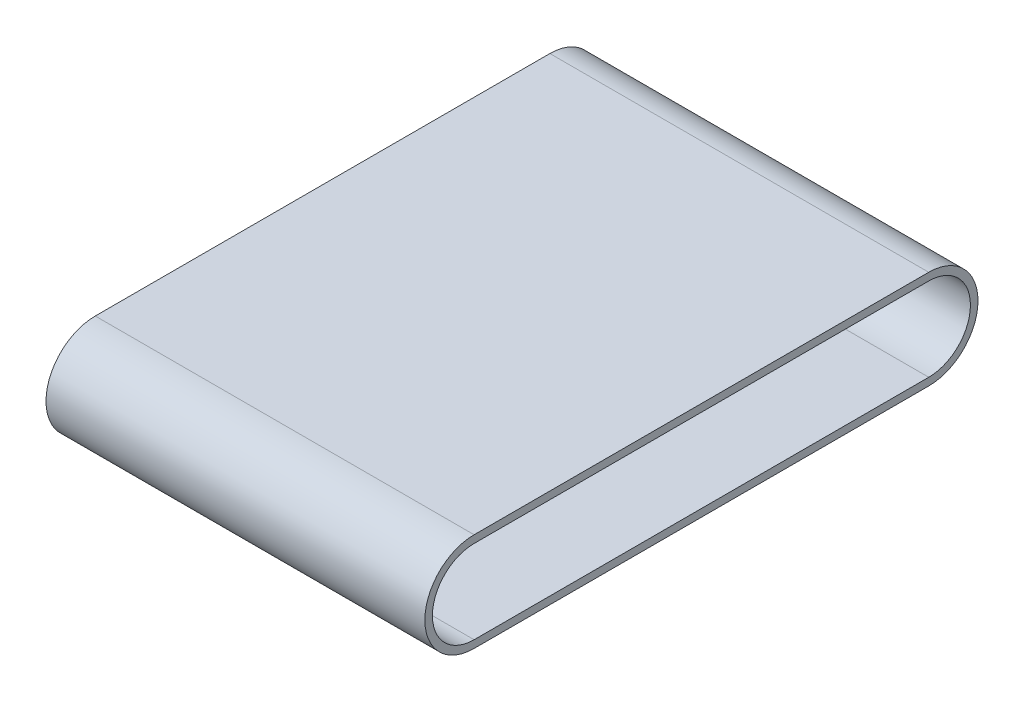
ISO-10303-21;
HEADER;
FILE_DESCRIPTION(('STEP AP214'),'2;1');
FILE_NAME('part.step','',(''),(''),'','','');
FILE_SCHEMA(('AUTOMOTIVE_DESIGN { 1 0 10303 214 1 1 1 1 }'));
ENDSEC;
DATA;
#1=APPLICATION_CONTEXT('core data for automotive mechanical design processes');
#2=APPLICATION_PROTOCOL_DEFINITION('international standard','automotive_design',2000,#1);
#3=PRODUCT_CONTEXT('',#1,'mechanical');
#4=PRODUCT('Part','Part','',(#3));
#5=PRODUCT_RELATED_PRODUCT_CATEGORY('part','',(#4));
#6=PRODUCT_DEFINITION_FORMATION('','',#4);
#7=PRODUCT_DEFINITION_CONTEXT('part definition',#1,'design');
#8=PRODUCT_DEFINITION('design','',#6,#7);
#9=PRODUCT_DEFINITION_SHAPE('','',#8);
#10=(LENGTH_UNIT() NAMED_UNIT(*) SI_UNIT(.MILLI.,.METRE.));
#11=(NAMED_UNIT(*) PLANE_ANGLE_UNIT() SI_UNIT($,.RADIAN.));
#12=(NAMED_UNIT(*) SI_UNIT($,.STERADIAN.) SOLID_ANGLE_UNIT());
#13=UNCERTAINTY_MEASURE_WITH_UNIT(LENGTH_MEASURE(1.E-05),#10,'distance_accuracy_value','');
#14=(GEOMETRIC_REPRESENTATION_CONTEXT(3) GLOBAL_UNCERTAINTY_ASSIGNED_CONTEXT((#13)) GLOBAL_UNIT_ASSIGNED_CONTEXT((#10,
#11,#12)) REPRESENTATION_CONTEXT('',''));
#15=CARTESIAN_POINT('',(0.,0.,0.));
#16=DIRECTION('',(0.,0.,1.));
#17=DIRECTION('',(1.,0.,0.));
#18=AXIS2_PLACEMENT_3D('',#15,#16,#17);
#19=CARTESIAN_POINT('',(100.,22.8481012658228,183.678713125152));
#20=DIRECTION('',(1.,0.,0.));
#21=DIRECTION('',(0.,0.,-1.));
#22=AXIS2_PLACEMENT_3D('',#19,#20,#21);
#23=PLANE('',#22);
#24=CARTESIAN_POINT('',(100.,22.8481012658228,183.678713125152));
#25=DIRECTION('',(1.,0.,0.));
#26=DIRECTION('',(0.,0.,-1.));
#27=AXIS2_PLACEMENT_3D('',#24,#25,#26);
#28=CIRCLE('',#27,13.);
#29=CARTESIAN_POINT('',(100.,35.8481012658228,183.678713125152));
#30=VERTEX_POINT('',#29);
#31=CARTESIAN_POINT('',(100.,9.84810126582282,183.678713125152));
#32=VERTEX_POINT('',#31);
#33=EDGE_CURVE('E136',#30,#32,#28,.T.);
#34=ORIENTED_EDGE('',*,*,#33,.T.);
#35=DIRECTION('',(0.,0.,-1.));
#36=VECTOR('',#35,1.);
#37=CARTESIAN_POINT('',(100.,9.84810126582282,183.678713125152));
#38=LINE('',#37,#36);
#39=CARTESIAN_POINT('',(100.,9.84810126582283,63.6787131251518));
#40=VERTEX_POINT('',#39);
#41=EDGE_CURVE('E139',#32,#40,#38,.T.);
#42=ORIENTED_EDGE('',*,*,#41,.T.);
#43=CARTESIAN_POINT('',(100.,22.8481012658228,63.6787131251518));
#44=DIRECTION('',(1.,0.,0.));
#45=DIRECTION('',(0.,0.,1.));
#46=AXIS2_PLACEMENT_3D('',#43,#44,#45);
#47=CIRCLE('',#46,13.);
#48=CARTESIAN_POINT('',(100.,35.8481012658228,63.6787131251518));
#49=VERTEX_POINT('',#48);
#50=EDGE_CURVE('E142',#40,#49,#47,.T.);
#51=ORIENTED_EDGE('',*,*,#50,.T.);
#52=DIRECTION('',(0.,0.,1.));
#53=VECTOR('',#52,1.);
#54=CARTESIAN_POINT('',(100.,35.8481012658228,183.678713125152));
#55=LINE('',#54,#53);
#56=EDGE_CURVE('E144',#49,#30,#55,.T.);
#57=ORIENTED_EDGE('',*,*,#56,.T.);
#58=EDGE_LOOP('',(#34,#42,#51,#57));
#59=FACE_BOUND('',#58,.T.);
#60=DIRECTION('',(0.,0.,-1.));
#61=VECTOR('',#60,1.);
#62=CARTESIAN_POINT('',(100.,11.8481012658228,183.678713125152));
#63=LINE('',#62,#61);
#64=CARTESIAN_POINT('',(100.,11.8481012658228,183.678713125152));
#65=VERTEX_POINT('',#64);
#66=CARTESIAN_POINT('',(100.,11.8481012658228,63.6787131251518));
#67=VERTEX_POINT('',#66);
#68=EDGE_CURVE('E108',#65,#67,#63,.T.);
#69=ORIENTED_EDGE('',*,*,#68,.F.);
#70=CARTESIAN_POINT('',(100.,22.8481012658228,183.678713125152));
#71=DIRECTION('',(1.,0.,0.));
#72=DIRECTION('',(0.,0.,-1.));
#73=AXIS2_PLACEMENT_3D('',#70,#71,#72);
#74=CIRCLE('',#73,11.);
#75=CARTESIAN_POINT('',(100.,33.8481012658228,183.678713125152));
#76=VERTEX_POINT('',#75);
#77=EDGE_CURVE('E100',#76,#65,#74,.T.);
#78=ORIENTED_EDGE('',*,*,#77,.F.);
#79=DIRECTION('',(0.,0.,1.));
#80=VECTOR('',#79,1.);
#81=CARTESIAN_POINT('',(100.,33.8481012658228,183.678713125152));
#82=LINE('',#81,#80);
#83=CARTESIAN_POINT('',(100.,33.8481012658228,63.6787131251518));
#84=VERTEX_POINT('',#83);
#85=EDGE_CURVE('E122',#84,#76,#82,.T.);
#86=ORIENTED_EDGE('',*,*,#85,.F.);
#87=CARTESIAN_POINT('',(100.,22.8481012658228,63.6787131251518));
#88=DIRECTION('',(1.,0.,0.));
#89=DIRECTION('',(0.,0.,1.));
#90=AXIS2_PLACEMENT_3D('',#87,#88,#89);
#91=CIRCLE('',#90,11.);
#92=EDGE_CURVE('E120',#67,#84,#91,.T.);
#93=ORIENTED_EDGE('',*,*,#92,.F.);
#94=EDGE_LOOP('',(#69,#78,#86,#93));
#95=FACE_BOUND('',#94,.T.);
#96=ADVANCED_FACE('F35',(#59,#95),#23,.T.);
#97=CARTESIAN_POINT('',(0.,22.8481012658228,183.678713125152));
#98=DIRECTION('',(1.,0.,0.));
#99=DIRECTION('',(0.,0.,-1.));
#100=AXIS2_PLACEMENT_3D('',#97,#98,#99);
#101=PLANE('',#100);
#102=CARTESIAN_POINT('',(0.,22.8481012658228,183.678713125152));
#103=DIRECTION('',(1.,0.,0.));
#104=DIRECTION('',(0.,0.,-1.));
#105=AXIS2_PLACEMENT_3D('',#102,#103,#104);
#106=CIRCLE('',#105,13.);
#107=CARTESIAN_POINT('',(0.,35.8481012658228,183.678713125152));
#108=VERTEX_POINT('',#107);
#109=CARTESIAN_POINT('',(0.,9.84810126582282,183.678713125152));
#110=VERTEX_POINT('',#109);
#111=EDGE_CURVE('E116',#108,#110,#106,.T.);
#112=ORIENTED_EDGE('',*,*,#111,.F.);
#113=DIRECTION('',(0.,0.,1.));
#114=VECTOR('',#113,1.);
#115=CARTESIAN_POINT('',(0.,35.8481012658228,183.678713125152));
#116=LINE('',#115,#114);
#117=CARTESIAN_POINT('',(0.,35.8481012658228,63.6787131251518));
#118=VERTEX_POINT('',#117);
#119=EDGE_CURVE('E140',#118,#108,#116,.T.);
#120=ORIENTED_EDGE('',*,*,#119,.F.);
#121=CARTESIAN_POINT('',(0.,22.8481012658228,63.6787131251518));
#122=DIRECTION('',(1.,0.,0.));
#123=DIRECTION('',(0.,0.,1.));
#124=AXIS2_PLACEMENT_3D('',#121,#122,#123);
#125=CIRCLE('',#124,13.);
#126=CARTESIAN_POINT('',(0.,9.84810126582283,63.6787131251518));
#127=VERTEX_POINT('',#126);
#128=EDGE_CURVE('E151',#127,#118,#125,.T.);
#129=ORIENTED_EDGE('',*,*,#128,.F.);
#130=DIRECTION('',(0.,0.,-1.));
#131=VECTOR('',#130,1.);
#132=CARTESIAN_POINT('',(0.,9.84810126582282,183.678713125152));
#133=LINE('',#132,#131);
#134=EDGE_CURVE('E149',#110,#127,#133,.T.);
#135=ORIENTED_EDGE('',*,*,#134,.F.);
#136=EDGE_LOOP('',(#112,#120,#129,#135));
#137=FACE_BOUND('',#136,.T.);
#138=CARTESIAN_POINT('',(0.,22.8481012658228,183.678713125152));
#139=DIRECTION('',(1.,0.,0.));
#140=DIRECTION('',(0.,0.,-1.));
#141=AXIS2_PLACEMENT_3D('',#138,#139,#140);
#142=CIRCLE('',#141,11.);
#143=CARTESIAN_POINT('',(0.,33.8481012658228,183.678713125152));
#144=VERTEX_POINT('',#143);
#145=CARTESIAN_POINT('',(0.,11.8481012658228,183.678713125152));
#146=VERTEX_POINT('',#145);
#147=EDGE_CURVE('E58',#144,#146,#142,.T.);
#148=ORIENTED_EDGE('',*,*,#147,.T.);
#149=DIRECTION('',(0.,0.,-1.));
#150=VECTOR('',#149,1.);
#151=CARTESIAN_POINT('',(0.,11.8481012658228,183.678713125152));
#152=LINE('',#151,#150);
#153=CARTESIAN_POINT('',(0.,11.8481012658228,63.6787131251518));
#154=VERTEX_POINT('',#153);
#155=EDGE_CURVE('E115',#146,#154,#152,.T.);
#156=ORIENTED_EDGE('',*,*,#155,.T.);
#157=CARTESIAN_POINT('',(0.,22.8481012658228,63.6787131251518));
#158=DIRECTION('',(1.,0.,0.));
#159=DIRECTION('',(0.,0.,1.));
#160=AXIS2_PLACEMENT_3D('',#157,#158,#159);
#161=CIRCLE('',#160,11.);
#162=CARTESIAN_POINT('',(0.,33.8481012658228,63.6787131251518));
#163=VERTEX_POINT('',#162);
#164=EDGE_CURVE('E128',#154,#163,#161,.T.);
#165=ORIENTED_EDGE('',*,*,#164,.T.);
#166=DIRECTION('',(0.,0.,1.));
#167=VECTOR('',#166,1.);
#168=CARTESIAN_POINT('',(0.,33.8481012658228,183.678713125152));
#169=LINE('',#168,#167);
#170=EDGE_CURVE('E109',#163,#144,#169,.T.);
#171=ORIENTED_EDGE('',*,*,#170,.T.);
#172=EDGE_LOOP('',(#148,#156,#165,#171));
#173=FACE_BOUND('',#172,.T.);
#174=ADVANCED_FACE('F169',(#137,#173),#101,.F.);
#175=CARTESIAN_POINT('',(100.,22.8481012658228,183.678713125152));
#176=DIRECTION('',(-1.,0.,0.));
#177=DIRECTION('',(0.,0.,1.));
#178=AXIS2_PLACEMENT_3D('',#175,#176,#177);
#179=CYLINDRICAL_SURFACE('',#178,13.);
#180=ORIENTED_EDGE('',*,*,#111,.T.);
#181=DIRECTION('',(-1.,0.,0.));
#182=VECTOR('',#181,1.);
#183=CARTESIAN_POINT('',(100.,9.84810126582282,183.678713125152));
#184=LINE('',#183,#182);
#185=EDGE_CURVE('E11',#32,#110,#184,.T.);
#186=ORIENTED_EDGE('',*,*,#185,.F.);
#187=ORIENTED_EDGE('',*,*,#33,.F.);
#188=DIRECTION('',(-1.,0.,0.));
#189=VECTOR('',#188,1.);
#190=CARTESIAN_POINT('',(100.,35.8481012658228,183.678713125152));
#191=LINE('',#190,#189);
#192=EDGE_CURVE('E146',#30,#108,#191,.T.);
#193=ORIENTED_EDGE('',*,*,#192,.T.);
#194=EDGE_LOOP('',(#180,#186,#187,#193));
#195=FACE_BOUND('',#194,.T.);
#196=ADVANCED_FACE('F37',(#195),#179,.T.);
#197=CARTESIAN_POINT('',(100.,9.84810126582282,183.678713125152));
#198=DIRECTION('',(0.,1.,0.));
#199=DIRECTION('',(0.,0.,1.));
#200=AXIS2_PLACEMENT_3D('',#197,#198,#199);
#201=PLANE('',#200);
#202=ORIENTED_EDGE('',*,*,#134,.T.);
#203=DIRECTION('',(-1.,0.,0.));
#204=VECTOR('',#203,1.);
#205=CARTESIAN_POINT('',(100.,9.84810126582283,63.6787131251518));
#206=LINE('',#205,#204);
#207=EDGE_CURVE('E43',#40,#127,#206,.T.);
#208=ORIENTED_EDGE('',*,*,#207,.F.);
#209=ORIENTED_EDGE('',*,*,#41,.F.);
#210=ORIENTED_EDGE('',*,*,#185,.T.);
#211=EDGE_LOOP('',(#202,#208,#209,#210));
#212=FACE_BOUND('',#211,.T.);
#213=ADVANCED_FACE('F179',(#212),#201,.F.);
#214=CARTESIAN_POINT('',(100.,22.8481012658228,63.6787131251518));
#215=DIRECTION('',(-1.,0.,0.));
#216=DIRECTION('',(0.,0.,1.));
#217=AXIS2_PLACEMENT_3D('',#214,#215,#216);
#218=CYLINDRICAL_SURFACE('',#217,13.);
#219=ORIENTED_EDGE('',*,*,#128,.T.);
#220=DIRECTION('',(-1.,0.,0.));
#221=VECTOR('',#220,1.);
#222=CARTESIAN_POINT('',(100.,35.8481012658228,63.6787131251518));
#223=LINE('',#222,#221);
#224=EDGE_CURVE('E156',#49,#118,#223,.T.);
#225=ORIENTED_EDGE('',*,*,#224,.F.);
#226=ORIENTED_EDGE('',*,*,#50,.F.);
#227=ORIENTED_EDGE('',*,*,#207,.T.);
#228=EDGE_LOOP('',(#219,#225,#226,#227));
#229=FACE_BOUND('',#228,.T.);
#230=ADVANCED_FACE('F163',(#229),#218,.T.);
#231=CARTESIAN_POINT('',(100.,35.8481012658228,183.678713125152));
#232=DIRECTION('',(0.,-1.,0.));
#233=DIRECTION('',(0.,0.,-1.));
#234=AXIS2_PLACEMENT_3D('',#231,#232,#233);
#235=PLANE('',#234);
#236=ORIENTED_EDGE('',*,*,#119,.T.);
#237=ORIENTED_EDGE('',*,*,#192,.F.);
#238=ORIENTED_EDGE('',*,*,#56,.F.);
#239=ORIENTED_EDGE('',*,*,#224,.T.);
#240=EDGE_LOOP('',(#236,#237,#238,#239));
#241=FACE_BOUND('',#240,.T.);
#242=ADVANCED_FACE('F173',(#241),#235,.F.);
#243=CARTESIAN_POINT('',(100.,22.8481012658228,183.678713125152));
#244=DIRECTION('',(-1.,0.,0.));
#245=DIRECTION('',(0.,0.,1.));
#246=AXIS2_PLACEMENT_3D('',#243,#244,#245);
#247=CYLINDRICAL_SURFACE('',#246,11.);
#248=ORIENTED_EDGE('',*,*,#147,.F.);
#249=DIRECTION('',(-1.,0.,0.));
#250=VECTOR('',#249,1.);
#251=CARTESIAN_POINT('',(100.,33.8481012658228,183.678713125152));
#252=LINE('',#251,#250);
#253=EDGE_CURVE('E104',#76,#144,#252,.T.);
#254=ORIENTED_EDGE('',*,*,#253,.F.);
#255=ORIENTED_EDGE('',*,*,#77,.T.);
#256=DIRECTION('',(-1.,0.,0.));
#257=VECTOR('',#256,1.);
#258=CARTESIAN_POINT('',(100.,11.8481012658228,183.678713125152));
#259=LINE('',#258,#257);
#260=EDGE_CURVE('E103',#65,#146,#259,.T.);
#261=ORIENTED_EDGE('',*,*,#260,.T.);
#262=EDGE_LOOP('',(#248,#254,#255,#261));
#263=FACE_BOUND('',#262,.T.);
#264=ADVANCED_FACE('F102',(#263),#247,.F.);
#265=CARTESIAN_POINT('',(100.,11.8481012658228,183.678713125152));
#266=DIRECTION('',(0.,1.,0.));
#267=DIRECTION('',(0.,0.,1.));
#268=AXIS2_PLACEMENT_3D('',#265,#266,#267);
#269=PLANE('',#268);
#270=ORIENTED_EDGE('',*,*,#155,.F.);
#271=ORIENTED_EDGE('',*,*,#260,.F.);
#272=ORIENTED_EDGE('',*,*,#68,.T.);
#273=DIRECTION('',(-1.,0.,0.));
#274=VECTOR('',#273,1.);
#275=CARTESIAN_POINT('',(100.,11.8481012658228,63.6787131251518));
#276=LINE('',#275,#274);
#277=EDGE_CURVE('E117',#67,#154,#276,.T.);
#278=ORIENTED_EDGE('',*,*,#277,.T.);
#279=EDGE_LOOP('',(#270,#271,#272,#278));
#280=FACE_BOUND('',#279,.T.);
#281=ADVANCED_FACE('F112',(#280),#269,.T.);
#282=CARTESIAN_POINT('',(100.,22.8481012658228,63.6787131251518));
#283=DIRECTION('',(-1.,0.,0.));
#284=DIRECTION('',(0.,0.,1.));
#285=AXIS2_PLACEMENT_3D('',#282,#283,#284);
#286=CYLINDRICAL_SURFACE('',#285,11.);
#287=ORIENTED_EDGE('',*,*,#164,.F.);
#288=ORIENTED_EDGE('',*,*,#277,.F.);
#289=ORIENTED_EDGE('',*,*,#92,.T.);
#290=DIRECTION('',(-1.,0.,0.));
#291=VECTOR('',#290,1.);
#292=CARTESIAN_POINT('',(100.,33.8481012658228,63.6787131251518));
#293=LINE('',#292,#291);
#294=EDGE_CURVE('E50',#84,#163,#293,.T.);
#295=ORIENTED_EDGE('',*,*,#294,.T.);
#296=EDGE_LOOP('',(#287,#288,#289,#295));
#297=FACE_BOUND('',#296,.T.);
#298=ADVANCED_FACE('F202',(#297),#286,.F.);
#299=CARTESIAN_POINT('',(100.,33.8481012658228,183.678713125152));
#300=DIRECTION('',(0.,-1.,0.));
#301=DIRECTION('',(0.,0.,-1.));
#302=AXIS2_PLACEMENT_3D('',#299,#300,#301);
#303=PLANE('',#302);
#304=ORIENTED_EDGE('',*,*,#170,.F.);
#305=ORIENTED_EDGE('',*,*,#294,.F.);
#306=ORIENTED_EDGE('',*,*,#85,.T.);
#307=ORIENTED_EDGE('',*,*,#253,.T.);
#308=EDGE_LOOP('',(#304,#305,#306,#307));
#309=FACE_BOUND('',#308,.T.);
#310=ADVANCED_FACE('F206',(#309),#303,.T.);
#311=CLOSED_SHELL('',(#96,#174,#196,#213,#230,#242,#264,#281,#298,#310));
#312=MANIFOLD_SOLID_BREP('B2',#311);
#313=ADVANCED_BREP_SHAPE_REPRESENTATION('',(#18,#312),#14);
#314=SHAPE_DEFINITION_REPRESENTATION(#9,#313);
ENDSEC;
END-ISO-10303-21;
